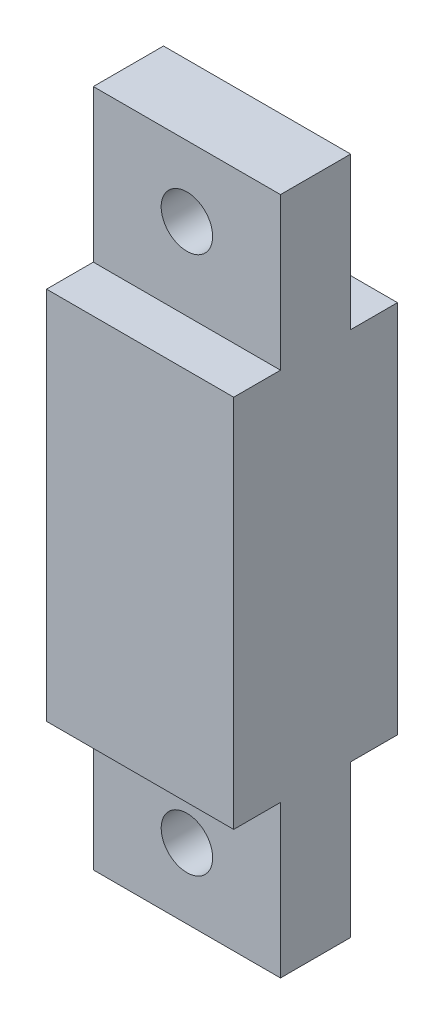
ISO-10303-21;
HEADER;
FILE_DESCRIPTION(('STEP AP214'),'2;1');
FILE_NAME('part.step','',(''),(''),'','','');
FILE_SCHEMA(('AUTOMOTIVE_DESIGN { 1 0 10303 214 1 1 1 1 }'));
ENDSEC;
DATA;
#1=APPLICATION_CONTEXT('core data for automotive mechanical design processes');
#2=APPLICATION_PROTOCOL_DEFINITION('international standard','automotive_design',2000,#1);
#3=PRODUCT_CONTEXT('',#1,'mechanical');
#4=PRODUCT('Part','Part','',(#3));
#5=PRODUCT_RELATED_PRODUCT_CATEGORY('part','',(#4));
#6=PRODUCT_DEFINITION_FORMATION('','',#4);
#7=PRODUCT_DEFINITION_CONTEXT('part definition',#1,'design');
#8=PRODUCT_DEFINITION('design','',#6,#7);
#9=PRODUCT_DEFINITION_SHAPE('','',#8);
#10=(LENGTH_UNIT() NAMED_UNIT(*) SI_UNIT(.MILLI.,.METRE.));
#11=(NAMED_UNIT(*) PLANE_ANGLE_UNIT() SI_UNIT($,.RADIAN.));
#12=(NAMED_UNIT(*) SI_UNIT($,.STERADIAN.) SOLID_ANGLE_UNIT());
#13=UNCERTAINTY_MEASURE_WITH_UNIT(LENGTH_MEASURE(1.E-05),#10,'distance_accuracy_value','');
#14=(GEOMETRIC_REPRESENTATION_CONTEXT(3) GLOBAL_UNCERTAINTY_ASSIGNED_CONTEXT((#13)) GLOBAL_UNIT_ASSIGNED_CONTEXT((#10,
#11,#12)) REPRESENTATION_CONTEXT('',''));
#15=CARTESIAN_POINT('',(0.,0.,0.));
#16=DIRECTION('',(0.,0.,1.));
#17=DIRECTION('',(1.,0.,0.));
#18=AXIS2_PLACEMENT_3D('',#15,#16,#17);
#19=CARTESIAN_POINT('',(0.,0.,3.));
#20=DIRECTION('',(0.,0.,1.));
#21=DIRECTION('',(1.,0.,0.));
#22=AXIS2_PLACEMENT_3D('',#19,#20,#21);
#23=PLANE('',#22);
#24=CARTESIAN_POINT('',(0.,-11.5,3.));
#25=DIRECTION('',(0.,0.,1.));
#26=DIRECTION('',(-1.,0.,0.));
#27=AXIS2_PLACEMENT_3D('',#24,#25,#26);
#28=CIRCLE('',#27,1.1);
#29=CARTESIAN_POINT('',(-1.1,-11.5,3.));
#30=VERTEX_POINT('',#29);
#31=EDGE_CURVE('E401',#30,#30,#28,.T.);
#32=ORIENTED_EDGE('',*,*,#31,.F.);
#33=EDGE_LOOP('',(#32));
#34=FACE_BOUND('',#33,.T.);
#35=DIRECTION('',(0.,1.,0.));
#36=VECTOR('',#35,1.);
#37=CARTESIAN_POINT('',(4.,14.5,3.));
#38=LINE('',#37,#36);
#39=CARTESIAN_POINT('',(4.,-14.5,3.));
#40=VERTEX_POINT('',#39);
#41=CARTESIAN_POINT('',(4.,-8.,3.));
#42=VERTEX_POINT('',#41);
#43=EDGE_CURVE('E187',#40,#42,#38,.T.);
#44=ORIENTED_EDGE('',*,*,#43,.T.);
#45=DIRECTION('',(-1.,0.,0.));
#46=VECTOR('',#45,1.);
#47=CARTESIAN_POINT('',(0.,-8.,3.));
#48=LINE('',#47,#46);
#49=CARTESIAN_POINT('',(-4.,-8.,3.));
#50=VERTEX_POINT('',#49);
#51=EDGE_CURVE('E129',#42,#50,#48,.T.);
#52=ORIENTED_EDGE('',*,*,#51,.T.);
#53=DIRECTION('',(0.,-1.,0.));
#54=VECTOR('',#53,1.);
#55=CARTESIAN_POINT('',(-4.,14.5,3.));
#56=LINE('',#55,#54);
#57=CARTESIAN_POINT('',(-4.,-14.5,3.));
#58=VERTEX_POINT('',#57);
#59=EDGE_CURVE('E192',#50,#58,#56,.T.);
#60=ORIENTED_EDGE('',*,*,#59,.T.);
#61=DIRECTION('',(1.,0.,0.));
#62=VECTOR('',#61,1.);
#63=CARTESIAN_POINT('',(-4.,-14.5,3.));
#64=LINE('',#63,#62);
#65=EDGE_CURVE('E196',#58,#40,#64,.T.);
#66=ORIENTED_EDGE('',*,*,#65,.T.);
#67=EDGE_LOOP('',(#44,#52,#60,#66));
#68=FACE_BOUND('',#67,.T.);
#69=ADVANCED_FACE('F33',(#34,#68),#23,.T.);
#70=CARTESIAN_POINT('',(0.,11.5,3.));
#71=DIRECTION('',(0.,0.,1.));
#72=DIRECTION('',(1.,0.,0.));
#73=AXIS2_PLACEMENT_3D('',#70,#71,#72);
#74=CIRCLE('',#73,1.1);
#75=CARTESIAN_POINT('',(1.1,11.5,3.));
#76=VERTEX_POINT('',#75);
#77=EDGE_CURVE('E400',#76,#76,#74,.T.);
#78=ORIENTED_EDGE('',*,*,#77,.F.);
#79=EDGE_LOOP('',(#78));
#80=FACE_BOUND('',#79,.T.);
#81=CARTESIAN_POINT('',(-4.,14.5,3.));
#82=VERTEX_POINT('',#81);
#83=CARTESIAN_POINT('',(-4.,8.,3.));
#84=VERTEX_POINT('',#83);
#85=EDGE_CURVE('E193',#82,#84,#56,.T.);
#86=ORIENTED_EDGE('',*,*,#85,.T.);
#87=DIRECTION('',(1.,0.,0.));
#88=VECTOR('',#87,1.);
#89=CARTESIAN_POINT('',(0.,8.,3.));
#90=LINE('',#89,#88);
#91=CARTESIAN_POINT('',(4.,8.,3.));
#92=VERTEX_POINT('',#91);
#93=EDGE_CURVE('E148',#84,#92,#90,.T.);
#94=ORIENTED_EDGE('',*,*,#93,.T.);
#95=CARTESIAN_POINT('',(4.,14.5,3.));
#96=VERTEX_POINT('',#95);
#97=EDGE_CURVE('E190',#92,#96,#38,.T.);
#98=ORIENTED_EDGE('',*,*,#97,.T.);
#99=DIRECTION('',(-1.,0.,0.));
#100=VECTOR('',#99,1.);
#101=CARTESIAN_POINT('',(-4.,14.5,3.));
#102=LINE('',#101,#100);
#103=EDGE_CURVE('E189',#96,#82,#102,.T.);
#104=ORIENTED_EDGE('',*,*,#103,.T.);
#105=EDGE_LOOP('',(#86,#94,#98,#104));
#106=FACE_BOUND('',#105,.T.);
#107=ADVANCED_FACE('F249',(#80,#106),#23,.T.);
#108=CARTESIAN_POINT('',(0.,0.,0.));
#109=DIRECTION('',(0.,0.,1.));
#110=DIRECTION('',(1.,0.,0.));
#111=AXIS2_PLACEMENT_3D('',#108,#109,#110);
#112=PLANE('',#111);
#113=CARTESIAN_POINT('',(0.,-11.5,0.));
#114=DIRECTION('',(0.,0.,1.));
#115=DIRECTION('',(1.,0.,0.));
#116=AXIS2_PLACEMENT_3D('',#113,#114,#115);
#117=CIRCLE('',#116,1.1);
#118=CARTESIAN_POINT('',(1.1,-11.5,0.));
#119=VERTEX_POINT('',#118);
#120=EDGE_CURVE('E152',#119,#119,#117,.F.);
#121=ORIENTED_EDGE('',*,*,#120,.F.);
#122=EDGE_LOOP('',(#121));
#123=FACE_BOUND('',#122,.T.);
#124=DIRECTION('',(0.,-1.,0.));
#125=VECTOR('',#124,1.);
#126=CARTESIAN_POINT('',(-4.,14.5,0.));
#127=LINE('',#126,#125);
#128=CARTESIAN_POINT('',(-4.,-8.,0.));
#129=VERTEX_POINT('',#128);
#130=CARTESIAN_POINT('',(-4.,-14.5,0.));
#131=VERTEX_POINT('',#130);
#132=EDGE_CURVE('E203',#129,#131,#127,.T.);
#133=ORIENTED_EDGE('',*,*,#132,.F.);
#134=DIRECTION('',(1.,0.,0.));
#135=VECTOR('',#134,1.);
#136=CARTESIAN_POINT('',(4.,-8.,0.));
#137=LINE('',#136,#135);
#138=CARTESIAN_POINT('',(4.,-8.,0.));
#139=VERTEX_POINT('',#138);
#140=EDGE_CURVE('E160',#129,#139,#137,.T.);
#141=ORIENTED_EDGE('',*,*,#140,.T.);
#142=DIRECTION('',(0.,1.,0.));
#143=VECTOR('',#142,1.);
#144=CARTESIAN_POINT('',(4.,14.5,0.));
#145=LINE('',#144,#143);
#146=CARTESIAN_POINT('',(4.,-14.5,0.));
#147=VERTEX_POINT('',#146);
#148=EDGE_CURVE('E199',#147,#139,#145,.T.);
#149=ORIENTED_EDGE('',*,*,#148,.F.);
#150=DIRECTION('',(1.,0.,0.));
#151=VECTOR('',#150,1.);
#152=CARTESIAN_POINT('',(-4.,-14.5,0.));
#153=LINE('',#152,#151);
#154=EDGE_CURVE('E207',#131,#147,#153,.T.);
#155=ORIENTED_EDGE('',*,*,#154,.F.);
#156=EDGE_LOOP('',(#133,#141,#149,#155));
#157=FACE_BOUND('',#156,.T.);
#158=ADVANCED_FACE('F240',(#123,#157),#112,.F.);
#159=CARTESIAN_POINT('',(4.,14.5,3.));
#160=DIRECTION('',(-1.,0.,0.));
#161=DIRECTION('',(0.,-1.,0.));
#162=AXIS2_PLACEMENT_3D('',#159,#160,#161);
#163=PLANE('',#162);
#164=ORIENTED_EDGE('',*,*,#148,.T.);
#165=DIRECTION('',(0.,0.,1.));
#166=VECTOR('',#165,1.);
#167=CARTESIAN_POINT('',(4.,-8.,-2.));
#168=LINE('',#167,#166);
#169=CARTESIAN_POINT('',(4.,-8.,-2.));
#170=VERTEX_POINT('',#169);
#171=EDGE_CURVE('E184',#170,#139,#168,.T.);
#172=ORIENTED_EDGE('',*,*,#171,.F.);
#173=DIRECTION('',(0.,1.,0.));
#174=VECTOR('',#173,1.);
#175=CARTESIAN_POINT('',(4.,8.,-2.));
#176=LINE('',#175,#174);
#177=CARTESIAN_POINT('',(4.,8.,-2.));
#178=VERTEX_POINT('',#177);
#179=EDGE_CURVE('E171',#170,#178,#176,.T.);
#180=ORIENTED_EDGE('',*,*,#179,.T.);
#181=DIRECTION('',(0.,0.,1.));
#182=VECTOR('',#181,1.);
#183=CARTESIAN_POINT('',(4.,8.,-2.));
#184=LINE('',#183,#182);
#185=CARTESIAN_POINT('',(4.,8.,0.));
#186=VERTEX_POINT('',#185);
#187=EDGE_CURVE('E182',#178,#186,#184,.T.);
#188=ORIENTED_EDGE('',*,*,#187,.T.);
#189=CARTESIAN_POINT('',(4.,14.5,0.));
#190=VERTEX_POINT('',#189);
#191=EDGE_CURVE('E181',#186,#190,#145,.T.);
#192=ORIENTED_EDGE('',*,*,#191,.T.);
#193=DIRECTION('',(0.,0.,-1.));
#194=VECTOR('',#193,1.);
#195=CARTESIAN_POINT('',(4.,14.5,3.));
#196=LINE('',#195,#194);
#197=EDGE_CURVE('E11',#96,#190,#196,.T.);
#198=ORIENTED_EDGE('',*,*,#197,.F.);
#199=ORIENTED_EDGE('',*,*,#97,.F.);
#200=DIRECTION('',(0.,0.,-1.));
#201=VECTOR('',#200,1.);
#202=CARTESIAN_POINT('',(4.,8.,5.));
#203=LINE('',#202,#201);
#204=CARTESIAN_POINT('',(4.,8.,5.));
#205=VERTEX_POINT('',#204);
#206=EDGE_CURVE('E48',#205,#92,#203,.T.);
#207=ORIENTED_EDGE('',*,*,#206,.F.);
#208=DIRECTION('',(0.,-1.,0.));
#209=VECTOR('',#208,1.);
#210=CARTESIAN_POINT('',(4.,0.,5.));
#211=LINE('',#210,#209);
#212=CARTESIAN_POINT('',(4.,-8.,5.));
#213=VERTEX_POINT('',#212);
#214=EDGE_CURVE('E142',#205,#213,#211,.T.);
#215=ORIENTED_EDGE('',*,*,#214,.T.);
#216=DIRECTION('',(0.,0.,-1.));
#217=VECTOR('',#216,1.);
#218=CARTESIAN_POINT('',(4.,-8.,5.));
#219=LINE('',#218,#217);
#220=EDGE_CURVE('E124',#213,#42,#219,.T.);
#221=ORIENTED_EDGE('',*,*,#220,.T.);
#222=ORIENTED_EDGE('',*,*,#43,.F.);
#223=DIRECTION('',(0.,0.,-1.));
#224=VECTOR('',#223,1.);
#225=CARTESIAN_POINT('',(4.,-14.5,3.));
#226=LINE('',#225,#224);
#227=EDGE_CURVE('E198',#40,#147,#226,.T.);
#228=ORIENTED_EDGE('',*,*,#227,.T.);
#229=EDGE_LOOP('',(#164,#172,#180,#188,#192,#198,#199,#207,#215,#221,#222,#228));
#230=FACE_BOUND('',#229,.T.);
#231=ADVANCED_FACE('F35',(#230),#163,.F.);
#232=CARTESIAN_POINT('',(-4.,14.5,3.));
#233=DIRECTION('',(0.,-1.,0.));
#234=DIRECTION('',(0.,0.,-1.));
#235=AXIS2_PLACEMENT_3D('',#232,#233,#234);
#236=PLANE('',#235);
#237=DIRECTION('',(-1.,0.,0.));
#238=VECTOR('',#237,1.);
#239=CARTESIAN_POINT('',(-4.,14.5,0.));
#240=LINE('',#239,#238);
#241=CARTESIAN_POINT('',(-4.,14.5,0.));
#242=VERTEX_POINT('',#241);
#243=EDGE_CURVE('E201',#190,#242,#240,.T.);
#244=ORIENTED_EDGE('',*,*,#243,.T.);
#245=DIRECTION('',(0.,0.,-1.));
#246=VECTOR('',#245,1.);
#247=CARTESIAN_POINT('',(-4.,14.5,3.));
#248=LINE('',#247,#246);
#249=EDGE_CURVE('E41',#82,#242,#248,.T.);
#250=ORIENTED_EDGE('',*,*,#249,.F.);
#251=ORIENTED_EDGE('',*,*,#103,.F.);
#252=ORIENTED_EDGE('',*,*,#197,.T.);
#253=EDGE_LOOP('',(#244,#250,#251,#252));
#254=FACE_BOUND('',#253,.T.);
#255=ADVANCED_FACE('F251',(#254),#236,.F.);
#256=CARTESIAN_POINT('',(-4.,14.5,3.));
#257=DIRECTION('',(1.,0.,0.));
#258=DIRECTION('',(0.,1.,0.));
#259=AXIS2_PLACEMENT_3D('',#256,#257,#258);
#260=PLANE('',#259);
#261=CARTESIAN_POINT('',(-4.,8.,0.));
#262=VERTEX_POINT('',#261);
#263=EDGE_CURVE('E204',#242,#262,#127,.T.);
#264=ORIENTED_EDGE('',*,*,#263,.T.);
#265=DIRECTION('',(0.,0.,1.));
#266=VECTOR('',#265,1.);
#267=CARTESIAN_POINT('',(-4.,8.,-2.));
#268=LINE('',#267,#266);
#269=CARTESIAN_POINT('',(-4.,8.,-2.));
#270=VERTEX_POINT('',#269);
#271=EDGE_CURVE('E56',#270,#262,#268,.T.);
#272=ORIENTED_EDGE('',*,*,#271,.F.);
#273=DIRECTION('',(0.,-1.,0.));
#274=VECTOR('',#273,1.);
#275=CARTESIAN_POINT('',(-4.,8.,-2.));
#276=LINE('',#275,#274);
#277=CARTESIAN_POINT('',(-4.,-8.,-2.));
#278=VERTEX_POINT('',#277);
#279=EDGE_CURVE('E164',#270,#278,#276,.T.);
#280=ORIENTED_EDGE('',*,*,#279,.T.);
#281=DIRECTION('',(0.,0.,1.));
#282=VECTOR('',#281,1.);
#283=CARTESIAN_POINT('',(-4.,-8.,-2.));
#284=LINE('',#283,#282);
#285=EDGE_CURVE('E176',#278,#129,#284,.T.);
#286=ORIENTED_EDGE('',*,*,#285,.T.);
#287=ORIENTED_EDGE('',*,*,#132,.T.);
#288=DIRECTION('',(0.,0.,-1.));
#289=VECTOR('',#288,1.);
#290=CARTESIAN_POINT('',(-4.,-14.5,3.));
#291=LINE('',#290,#289);
#292=EDGE_CURVE('E211',#58,#131,#291,.T.);
#293=ORIENTED_EDGE('',*,*,#292,.F.);
#294=ORIENTED_EDGE('',*,*,#59,.F.);
#295=DIRECTION('',(0.,0.,-1.));
#296=VECTOR('',#295,1.);
#297=CARTESIAN_POINT('',(-4.,-8.,5.));
#298=LINE('',#297,#296);
#299=CARTESIAN_POINT('',(-4.,-8.,5.));
#300=VERTEX_POINT('',#299);
#301=EDGE_CURVE('E134',#300,#50,#298,.T.);
#302=ORIENTED_EDGE('',*,*,#301,.F.);
#303=DIRECTION('',(0.,1.,0.));
#304=VECTOR('',#303,1.);
#305=CARTESIAN_POINT('',(-4.,0.,5.));
#306=LINE('',#305,#304);
#307=CARTESIAN_POINT('',(-4.,8.,5.));
#308=VERTEX_POINT('',#307);
#309=EDGE_CURVE('E144',#300,#308,#306,.T.);
#310=ORIENTED_EDGE('',*,*,#309,.T.);
#311=DIRECTION('',(0.,0.,-1.));
#312=VECTOR('',#311,1.);
#313=CARTESIAN_POINT('',(-4.,8.,5.));
#314=LINE('',#313,#312);
#315=EDGE_CURVE('E161',#308,#84,#314,.T.);
#316=ORIENTED_EDGE('',*,*,#315,.T.);
#317=ORIENTED_EDGE('',*,*,#85,.F.);
#318=ORIENTED_EDGE('',*,*,#249,.T.);
#319=EDGE_LOOP('',(#264,#272,#280,#286,#287,#293,#294,#302,#310,#316,#317,#318));
#320=FACE_BOUND('',#319,.T.);
#321=ADVANCED_FACE('F218',(#320),#260,.F.);
#322=CARTESIAN_POINT('',(-4.,-14.5,3.));
#323=DIRECTION('',(0.,1.,0.));
#324=DIRECTION('',(0.,0.,1.));
#325=AXIS2_PLACEMENT_3D('',#322,#323,#324);
#326=PLANE('',#325);
#327=ORIENTED_EDGE('',*,*,#154,.T.);
#328=ORIENTED_EDGE('',*,*,#227,.F.);
#329=ORIENTED_EDGE('',*,*,#65,.F.);
#330=ORIENTED_EDGE('',*,*,#292,.T.);
#331=EDGE_LOOP('',(#327,#328,#329,#330));
#332=FACE_BOUND('',#331,.T.);
#333=ADVANCED_FACE('F243',(#332),#326,.F.);
#334=CARTESIAN_POINT('',(0.,11.5,0.));
#335=DIRECTION('',(0.,0.,1.));
#336=DIRECTION('',(1.,0.,0.));
#337=AXIS2_PLACEMENT_3D('',#334,#335,#336);
#338=CIRCLE('',#337,1.1);
#339=CARTESIAN_POINT('',(1.1,11.5,0.));
#340=VERTEX_POINT('',#339);
#341=EDGE_CURVE('E157',#340,#340,#338,.F.);
#342=ORIENTED_EDGE('',*,*,#341,.F.);
#343=EDGE_LOOP('',(#342));
#344=FACE_BOUND('',#343,.T.);
#345=ORIENTED_EDGE('',*,*,#191,.F.);
#346=DIRECTION('',(-1.,0.,0.));
#347=VECTOR('',#346,1.);
#348=CARTESIAN_POINT('',(4.,8.,0.));
#349=LINE('',#348,#347);
#350=EDGE_CURVE('E168',#186,#262,#349,.T.);
#351=ORIENTED_EDGE('',*,*,#350,.T.);
#352=ORIENTED_EDGE('',*,*,#263,.F.);
#353=ORIENTED_EDGE('',*,*,#243,.F.);
#354=EDGE_LOOP('',(#345,#351,#352,#353));
#355=FACE_BOUND('',#354,.T.);
#356=ADVANCED_FACE('F224',(#344,#355),#112,.F.);
#357=CARTESIAN_POINT('',(4.,8.,-2.));
#358=DIRECTION('',(0.,1.,0.));
#359=DIRECTION('',(0.,0.,1.));
#360=AXIS2_PLACEMENT_3D('',#357,#358,#359);
#361=PLANE('',#360);
#362=ORIENTED_EDGE('',*,*,#350,.F.);
#363=ORIENTED_EDGE('',*,*,#187,.F.);
#364=DIRECTION('',(-1.,0.,0.));
#365=VECTOR('',#364,1.);
#366=CARTESIAN_POINT('',(4.,8.,-2.));
#367=LINE('',#366,#365);
#368=EDGE_CURVE('E174',#178,#270,#367,.T.);
#369=ORIENTED_EDGE('',*,*,#368,.T.);
#370=ORIENTED_EDGE('',*,*,#271,.T.);
#371=EDGE_LOOP('',(#362,#363,#369,#370));
#372=FACE_BOUND('',#371,.T.);
#373=ADVANCED_FACE('F225',(#372),#361,.T.);
#374=CARTESIAN_POINT('',(4.,-8.,-2.));
#375=DIRECTION('',(0.,-1.,0.));
#376=DIRECTION('',(0.,0.,-1.));
#377=AXIS2_PLACEMENT_3D('',#374,#375,#376);
#378=PLANE('',#377);
#379=ORIENTED_EDGE('',*,*,#140,.F.);
#380=ORIENTED_EDGE('',*,*,#285,.F.);
#381=DIRECTION('',(1.,0.,0.));
#382=VECTOR('',#381,1.);
#383=CARTESIAN_POINT('',(4.,-8.,-2.));
#384=LINE('',#383,#382);
#385=EDGE_CURVE('E167',#278,#170,#384,.T.);
#386=ORIENTED_EDGE('',*,*,#385,.T.);
#387=ORIENTED_EDGE('',*,*,#171,.T.);
#388=EDGE_LOOP('',(#379,#380,#386,#387));
#389=FACE_BOUND('',#388,.T.);
#390=ADVANCED_FACE('F236',(#389),#378,.T.);
#391=CARTESIAN_POINT('',(0.,0.,-2.));
#392=DIRECTION('',(0.,0.,-1.));
#393=DIRECTION('',(-1.,0.,0.));
#394=AXIS2_PLACEMENT_3D('',#391,#392,#393);
#395=PLANE('',#394);
#396=ORIENTED_EDGE('',*,*,#279,.F.);
#397=ORIENTED_EDGE('',*,*,#368,.F.);
#398=ORIENTED_EDGE('',*,*,#179,.F.);
#399=ORIENTED_EDGE('',*,*,#385,.F.);
#400=EDGE_LOOP('',(#396,#397,#398,#399));
#401=FACE_BOUND('',#400,.T.);
#402=ADVANCED_FACE('F231',(#401),#395,.T.);
#403=CARTESIAN_POINT('',(0.,8.,5.));
#404=DIRECTION('',(0.,1.,0.));
#405=DIRECTION('',(0.,0.,1.));
#406=AXIS2_PLACEMENT_3D('',#403,#404,#405);
#407=PLANE('',#406);
#408=ORIENTED_EDGE('',*,*,#93,.F.);
#409=ORIENTED_EDGE('',*,*,#315,.F.);
#410=DIRECTION('',(1.,0.,0.));
#411=VECTOR('',#410,1.);
#412=CARTESIAN_POINT('',(0.,8.,5.));
#413=LINE('',#412,#411);
#414=EDGE_CURVE('E135',#308,#205,#413,.T.);
#415=ORIENTED_EDGE('',*,*,#414,.T.);
#416=ORIENTED_EDGE('',*,*,#206,.T.);
#417=EDGE_LOOP('',(#408,#409,#415,#416));
#418=FACE_BOUND('',#417,.T.);
#419=ADVANCED_FACE('F247',(#418),#407,.T.);
#420=CARTESIAN_POINT('',(0.,-8.,5.));
#421=DIRECTION('',(0.,-1.,0.));
#422=DIRECTION('',(0.,0.,-1.));
#423=AXIS2_PLACEMENT_3D('',#420,#421,#422);
#424=PLANE('',#423);
#425=ORIENTED_EDGE('',*,*,#51,.F.);
#426=ORIENTED_EDGE('',*,*,#220,.F.);
#427=DIRECTION('',(-1.,0.,0.));
#428=VECTOR('',#427,1.);
#429=CARTESIAN_POINT('',(0.,-8.,5.));
#430=LINE('',#429,#428);
#431=EDGE_CURVE('E127',#213,#300,#430,.T.);
#432=ORIENTED_EDGE('',*,*,#431,.T.);
#433=ORIENTED_EDGE('',*,*,#301,.T.);
#434=EDGE_LOOP('',(#425,#426,#432,#433));
#435=FACE_BOUND('',#434,.T.);
#436=ADVANCED_FACE('F126',(#435),#424,.T.);
#437=CARTESIAN_POINT('',(0.,0.,5.));
#438=DIRECTION('',(0.,0.,-1.));
#439=DIRECTION('',(-1.,0.,0.));
#440=AXIS2_PLACEMENT_3D('',#437,#438,#439);
#441=PLANE('',#440);
#442=ORIENTED_EDGE('',*,*,#214,.F.);
#443=ORIENTED_EDGE('',*,*,#414,.F.);
#444=ORIENTED_EDGE('',*,*,#309,.F.);
#445=ORIENTED_EDGE('',*,*,#431,.F.);
#446=EDGE_LOOP('',(#442,#443,#444,#445));
#447=FACE_BOUND('',#446,.T.);
#448=ADVANCED_FACE('F140',(#447),#441,.F.);
#449=CARTESIAN_POINT('',(0.,11.5,-2.001));
#450=DIRECTION('',(0.,0.,1.));
#451=DIRECTION('',(1.,0.,0.));
#452=AXIS2_PLACEMENT_3D('',#449,#450,#451);
#453=CYLINDRICAL_SURFACE('',#452,1.1);
#454=ORIENTED_EDGE('',*,*,#77,.T.);
#455=EDGE_LOOP('',(#454));
#456=FACE_BOUND('',#455,.T.);
#457=ORIENTED_EDGE('',*,*,#341,.T.);
#458=EDGE_LOOP('',(#457));
#459=FACE_BOUND('',#458,.T.);
#460=ADVANCED_FACE('F318',(#456,#459),#453,.F.);
#461=CARTESIAN_POINT('',(0.,-11.5,-2.001));
#462=DIRECTION('',(0.,0.,1.));
#463=DIRECTION('',(1.,0.,0.));
#464=AXIS2_PLACEMENT_3D('',#461,#462,#463);
#465=CYLINDRICAL_SURFACE('',#464,1.1);
#466=ORIENTED_EDGE('',*,*,#31,.T.);
#467=EDGE_LOOP('',(#466));
#468=FACE_BOUND('',#467,.T.);
#469=ORIENTED_EDGE('',*,*,#120,.T.);
#470=EDGE_LOOP('',(#469));
#471=FACE_BOUND('',#470,.T.);
#472=ADVANCED_FACE('F324',(#468,#471),#465,.F.);
#473=CLOSED_SHELL('',(#69,#107,#158,#231,#255,#321,#333,#356,#373,#390,#402,#419,#436,#448,#460,#472));
#474=MANIFOLD_SOLID_BREP('B2',#473);
#475=ADVANCED_BREP_SHAPE_REPRESENTATION('',(#18,#474),#14);
#476=SHAPE_DEFINITION_REPRESENTATION(#9,#475);
ENDSEC;
END-ISO-10303-21;
